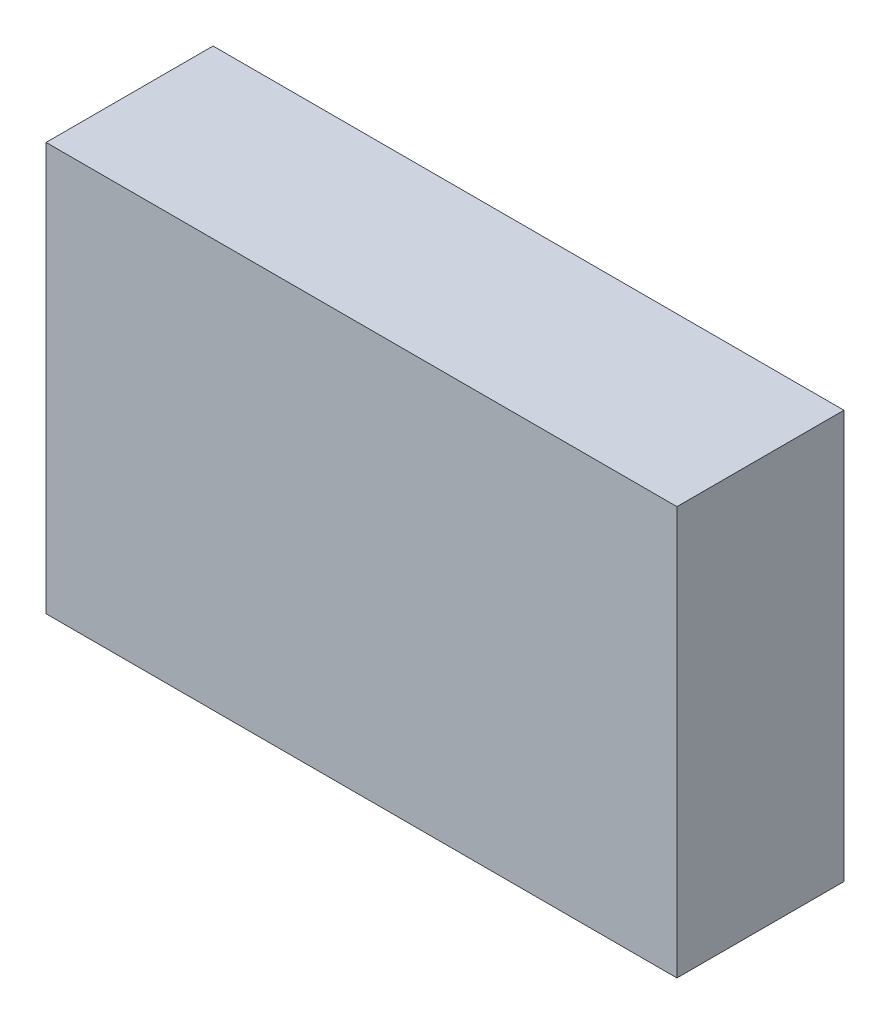
ISO-10303-21;
HEADER;
FILE_DESCRIPTION(('STEP AP214'),'2;1');
FILE_NAME('part.step','',(''),(''),'','','');
FILE_SCHEMA(('AUTOMOTIVE_DESIGN { 1 0 10303 214 1 1 1 1 }'));
ENDSEC;
DATA;
#1=APPLICATION_CONTEXT('core data for automotive mechanical design processes');
#2=APPLICATION_PROTOCOL_DEFINITION('international standard','automotive_design',2000,#1);
#3=PRODUCT_CONTEXT('',#1,'mechanical');
#4=PRODUCT('Part','Part','',(#3));
#5=PRODUCT_RELATED_PRODUCT_CATEGORY('part','',(#4));
#6=PRODUCT_DEFINITION_FORMATION('','',#4);
#7=PRODUCT_DEFINITION_CONTEXT('part definition',#1,'design');
#8=PRODUCT_DEFINITION('design','',#6,#7);
#9=PRODUCT_DEFINITION_SHAPE('','',#8);
#10=(LENGTH_UNIT() NAMED_UNIT(*) SI_UNIT(.MILLI.,.METRE.));
#11=(NAMED_UNIT(*) PLANE_ANGLE_UNIT() SI_UNIT($,.RADIAN.));
#12=(NAMED_UNIT(*) SI_UNIT($,.STERADIAN.) SOLID_ANGLE_UNIT());
#13=UNCERTAINTY_MEASURE_WITH_UNIT(LENGTH_MEASURE(1.E-05),#10,'distance_accuracy_value','');
#14=(GEOMETRIC_REPRESENTATION_CONTEXT(3) GLOBAL_UNCERTAINTY_ASSIGNED_CONTEXT((#13)) GLOBAL_UNIT_ASSIGNED_CONTEXT((#10,
#11,#12)) REPRESENTATION_CONTEXT('',''));
#15=CARTESIAN_POINT('',(0.,0.,0.));
#16=DIRECTION('',(0.,0.,1.));
#17=DIRECTION('',(1.,0.,0.));
#18=AXIS2_PLACEMENT_3D('',#15,#16,#17);
#19=CARTESIAN_POINT('',(107.95,-69.85,57.15));
#20=DIRECTION('',(-1.,0.,0.));
#21=DIRECTION('',(0.,0.,1.));
#22=AXIS2_PLACEMENT_3D('',#19,#20,#21);
#23=PLANE('',#22);
#24=DIRECTION('',(0.,1.,0.));
#25=VECTOR('',#24,1.);
#26=CARTESIAN_POINT('',(107.95,-69.85,0.));
#27=LINE('',#26,#25);
#28=CARTESIAN_POINT('',(107.95,-69.85,0.));
#29=VERTEX_POINT('',#28);
#30=CARTESIAN_POINT('',(107.95,69.85,0.));
#31=VERTEX_POINT('',#30);
#32=EDGE_CURVE('E98',#29,#31,#27,.T.);
#33=ORIENTED_EDGE('',*,*,#32,.T.);
#34=DIRECTION('',(0.,0.,-1.));
#35=VECTOR('',#34,1.);
#36=CARTESIAN_POINT('',(107.95,69.85,57.15));
#37=LINE('',#36,#35);
#38=CARTESIAN_POINT('',(107.95,69.85,57.15));
#39=VERTEX_POINT('',#38);
#40=EDGE_CURVE('E11',#39,#31,#37,.T.);
#41=ORIENTED_EDGE('',*,*,#40,.F.);
#42=DIRECTION('',(0.,1.,0.));
#43=VECTOR('',#42,1.);
#44=CARTESIAN_POINT('',(107.95,-69.85,57.15));
#45=LINE('',#44,#43);
#46=CARTESIAN_POINT('',(107.95,-69.85,57.15));
#47=VERTEX_POINT('',#46);
#48=EDGE_CURVE('E86',#47,#39,#45,.T.);
#49=ORIENTED_EDGE('',*,*,#48,.F.);
#50=DIRECTION('',(0.,0.,-1.));
#51=VECTOR('',#50,1.);
#52=CARTESIAN_POINT('',(107.95,-69.85,57.15));
#53=LINE('',#52,#51);
#54=EDGE_CURVE('E94',#47,#29,#53,.T.);
#55=ORIENTED_EDGE('',*,*,#54,.T.);
#56=EDGE_LOOP('',(#33,#41,#49,#55));
#57=FACE_BOUND('',#56,.T.);
#58=ADVANCED_FACE('F35',(#57),#23,.F.);
#59=CARTESIAN_POINT('',(-107.95,69.85,57.15));
#60=DIRECTION('',(0.,-1.,0.));
#61=DIRECTION('',(0.,0.,-1.));
#62=AXIS2_PLACEMENT_3D('',#59,#60,#61);
#63=PLANE('',#62);
#64=DIRECTION('',(-1.,0.,0.));
#65=VECTOR('',#64,1.);
#66=CARTESIAN_POINT('',(-107.95,69.85,0.));
#67=LINE('',#66,#65);
#68=CARTESIAN_POINT('',(-107.95,69.85,0.));
#69=VERTEX_POINT('',#68);
#70=EDGE_CURVE('E90',#31,#69,#67,.T.);
#71=ORIENTED_EDGE('',*,*,#70,.T.);
#72=DIRECTION('',(0.,0.,-1.));
#73=VECTOR('',#72,1.);
#74=CARTESIAN_POINT('',(-107.95,69.85,57.15));
#75=LINE('',#74,#73);
#76=CARTESIAN_POINT('',(-107.95,69.85,57.15));
#77=VERTEX_POINT('',#76);
#78=EDGE_CURVE('E43',#77,#69,#75,.T.);
#79=ORIENTED_EDGE('',*,*,#78,.F.);
#80=DIRECTION('',(-1.,0.,0.));
#81=VECTOR('',#80,1.);
#82=CARTESIAN_POINT('',(-107.95,69.85,57.15));
#83=LINE('',#82,#81);
#84=EDGE_CURVE('E81',#39,#77,#83,.T.);
#85=ORIENTED_EDGE('',*,*,#84,.F.);
#86=ORIENTED_EDGE('',*,*,#40,.T.);
#87=EDGE_LOOP('',(#71,#79,#85,#86));
#88=FACE_BOUND('',#87,.T.);
#89=ADVANCED_FACE('F89',(#88),#63,.F.);
#90=CARTESIAN_POINT('',(-107.95,-69.85,57.15));
#91=DIRECTION('',(1.,0.,0.));
#92=DIRECTION('',(0.,0.,-1.));
#93=AXIS2_PLACEMENT_3D('',#90,#91,#92);
#94=PLANE('',#93);
#95=DIRECTION('',(0.,-1.,0.));
#96=VECTOR('',#95,1.);
#97=CARTESIAN_POINT('',(-107.95,-69.85,0.));
#98=LINE('',#97,#96);
#99=CARTESIAN_POINT('',(-107.95,-69.85,0.));
#100=VERTEX_POINT('',#99);
#101=EDGE_CURVE('E68',#69,#100,#98,.T.);
#102=ORIENTED_EDGE('',*,*,#101,.T.);
#103=DIRECTION('',(0.,0.,-1.));
#104=VECTOR('',#103,1.);
#105=CARTESIAN_POINT('',(-107.95,-69.85,57.15));
#106=LINE('',#105,#104);
#107=CARTESIAN_POINT('',(-107.95,-69.85,57.15));
#108=VERTEX_POINT('',#107);
#109=EDGE_CURVE('E91',#108,#100,#106,.T.);
#110=ORIENTED_EDGE('',*,*,#109,.F.);
#111=DIRECTION('',(0.,-1.,0.));
#112=VECTOR('',#111,1.);
#113=CARTESIAN_POINT('',(-107.95,-69.85,57.15));
#114=LINE('',#113,#112);
#115=EDGE_CURVE('E84',#77,#108,#114,.T.);
#116=ORIENTED_EDGE('',*,*,#115,.F.);
#117=ORIENTED_EDGE('',*,*,#78,.T.);
#118=EDGE_LOOP('',(#102,#110,#116,#117));
#119=FACE_BOUND('',#118,.T.);
#120=ADVANCED_FACE('F92',(#119),#94,.F.);
#121=CARTESIAN_POINT('',(-107.95,-69.85,57.15));
#122=DIRECTION('',(0.,1.,0.));
#123=DIRECTION('',(0.,0.,1.));
#124=AXIS2_PLACEMENT_3D('',#121,#122,#123);
#125=PLANE('',#124);
#126=DIRECTION('',(1.,0.,0.));
#127=VECTOR('',#126,1.);
#128=CARTESIAN_POINT('',(-107.95,-69.85,0.));
#129=LINE('',#128,#127);
#130=EDGE_CURVE('E74',#100,#29,#129,.T.);
#131=ORIENTED_EDGE('',*,*,#130,.T.);
#132=ORIENTED_EDGE('',*,*,#54,.F.);
#133=DIRECTION('',(1.,0.,0.));
#134=VECTOR('',#133,1.);
#135=CARTESIAN_POINT('',(-107.95,-69.85,57.15));
#136=LINE('',#135,#134);
#137=EDGE_CURVE('E51',#108,#47,#136,.T.);
#138=ORIENTED_EDGE('',*,*,#137,.F.);
#139=ORIENTED_EDGE('',*,*,#109,.T.);
#140=EDGE_LOOP('',(#131,#132,#138,#139));
#141=FACE_BOUND('',#140,.T.);
#142=ADVANCED_FACE('F105',(#141),#125,.F.);
#143=CARTESIAN_POINT('',(0.,0.,57.15));
#144=DIRECTION('',(0.,0.,-1.));
#145=DIRECTION('',(-1.,0.,0.));
#146=AXIS2_PLACEMENT_3D('',#143,#144,#145);
#147=PLANE('',#146);
#148=ORIENTED_EDGE('',*,*,#48,.T.);
#149=ORIENTED_EDGE('',*,*,#84,.T.);
#150=ORIENTED_EDGE('',*,*,#115,.T.);
#151=ORIENTED_EDGE('',*,*,#137,.T.);
#152=EDGE_LOOP('',(#148,#149,#150,#151));
#153=FACE_BOUND('',#152,.T.);
#154=ADVANCED_FACE('F82',(#153),#147,.F.);
#155=CARTESIAN_POINT('',(0.,0.,0.));
#156=DIRECTION('',(0.,0.,-1.));
#157=DIRECTION('',(-1.,0.,0.));
#158=AXIS2_PLACEMENT_3D('',#155,#156,#157);
#159=PLANE('',#158);
#160=ORIENTED_EDGE('',*,*,#32,.F.);
#161=ORIENTED_EDGE('',*,*,#130,.F.);
#162=ORIENTED_EDGE('',*,*,#101,.F.);
#163=ORIENTED_EDGE('',*,*,#70,.F.);
#164=EDGE_LOOP('',(#160,#161,#162,#163));
#165=FACE_BOUND('',#164,.T.);
#166=ADVANCED_FACE('F108',(#165),#159,.T.);
#167=CLOSED_SHELL('',(#58,#89,#120,#142,#154,#166));
#168=MANIFOLD_SOLID_BREP('B2',#167);
#169=ADVANCED_BREP_SHAPE_REPRESENTATION('',(#18,#168),#14);
#170=SHAPE_DEFINITION_REPRESENTATION(#9,#169);
ENDSEC;
END-ISO-10303-21;
